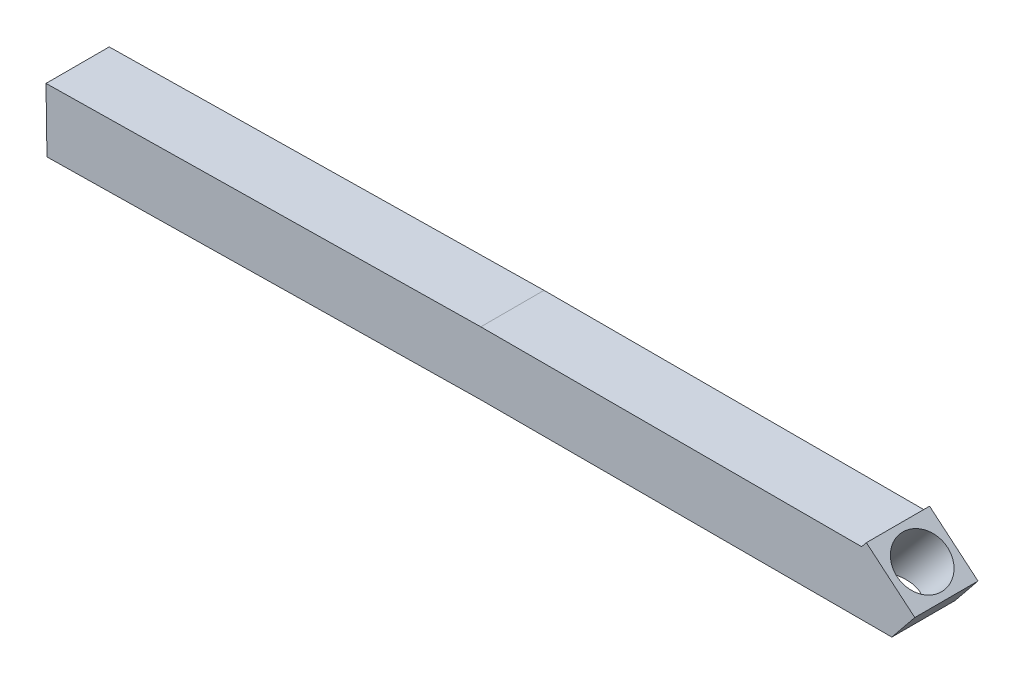
ISO-10303-21;
HEADER;
FILE_DESCRIPTION(('STEP AP214'),'2;1');
FILE_NAME('part.step','',(''),(''),'','','');
FILE_SCHEMA(('AUTOMOTIVE_DESIGN { 1 0 10303 214 1 1 1 1 }'));
ENDSEC;
DATA;
#1=APPLICATION_CONTEXT('core data for automotive mechanical design processes');
#2=APPLICATION_PROTOCOL_DEFINITION('international standard','automotive_design',2000,#1);
#3=PRODUCT_CONTEXT('',#1,'mechanical');
#4=PRODUCT('Part','Part','',(#3));
#5=PRODUCT_RELATED_PRODUCT_CATEGORY('part','',(#4));
#6=PRODUCT_DEFINITION_FORMATION('','',#4);
#7=PRODUCT_DEFINITION_CONTEXT('part definition',#1,'design');
#8=PRODUCT_DEFINITION('design','',#6,#7);
#9=PRODUCT_DEFINITION_SHAPE('','',#8);
#10=(LENGTH_UNIT() NAMED_UNIT(*) SI_UNIT(.MILLI.,.METRE.));
#11=(NAMED_UNIT(*) PLANE_ANGLE_UNIT() SI_UNIT($,.RADIAN.));
#12=(NAMED_UNIT(*) SI_UNIT($,.STERADIAN.) SOLID_ANGLE_UNIT());
#13=UNCERTAINTY_MEASURE_WITH_UNIT(LENGTH_MEASURE(1.E-05),#10,'distance_accuracy_value','');
#14=(GEOMETRIC_REPRESENTATION_CONTEXT(3) GLOBAL_UNCERTAINTY_ASSIGNED_CONTEXT((#13)) GLOBAL_UNIT_ASSIGNED_CONTEXT((#10,
#11,#12)) REPRESENTATION_CONTEXT('',''));
#15=CARTESIAN_POINT('',(0.,0.,0.));
#16=DIRECTION('',(0.,0.,1.));
#17=DIRECTION('',(1.,0.,0.));
#18=AXIS2_PLACEMENT_3D('',#15,#16,#17);
#19=CARTESIAN_POINT('',(0.,0.,2.5));
#20=DIRECTION('',(0.,0.,1.));
#21=DIRECTION('',(1.,0.,0.));
#22=AXIS2_PLACEMENT_3D('',#19,#20,#21);
#23=PLANE('',#22);
#24=DIRECTION('',(0.999885535757896,0.0151299498394764,0.));
#25=VECTOR('',#24,1.);
#26=CARTESIAN_POINT('',(-76.9054286503,-77.8084048068128,2.5));
#27=LINE('',#26,#25);
#28=CARTESIAN_POINT('',(-87.6042038829095,-77.9702952700952,2.5));
#29=VERTEX_POINT('',#28);
#30=CARTESIAN_POINT('',(-70.4061726678737,-77.7100601328562,2.5));
#31=VERTEX_POINT('',#30);
#32=EDGE_CURVE('E133',#29,#31,#27,.T.);
#33=ORIENTED_EDGE('',*,*,#32,.F.);
#34=DIRECTION('',(-0.0151299498394765,0.999885535757896,0.));
#35=VECTOR('',#34,1.);
#36=CARTESIAN_POINT('',(-87.6042038829095,-77.9702952700952,2.5));
#37=LINE('',#36,#35);
#38=CARTESIAN_POINT('',(-87.5663790083108,-80.4700091094899,2.5));
#39=VERTEX_POINT('',#38);
#40=EDGE_CURVE('E50',#39,#29,#37,.T.);
#41=ORIENTED_EDGE('',*,*,#40,.F.);
#42=DIRECTION('',(0.999885535757896,0.0151299498394764,0.));
#43=VECTOR('',#42,1.);
#44=CARTESIAN_POINT('',(-76.8676037757013,-80.3081186462075,2.5));
#45=LINE('',#44,#43);
#46=CARTESIAN_POINT('',(-70.368347793275,-80.2097739722509,2.5));
#47=VERTEX_POINT('',#46);
#48=EDGE_CURVE('E123',#39,#47,#45,.T.);
#49=ORIENTED_EDGE('',*,*,#48,.T.);
#50=DIRECTION('',(1.,0.,0.));
#51=VECTOR('',#50,1.);
#52=CARTESIAN_POINT('',(-70.368347793275,-80.209773972251,2.5));
#53=LINE('',#52,#51);
#54=CARTESIAN_POINT('',(-54.1489938572193,-80.209773972251,2.5));
#55=VERTEX_POINT('',#54);
#56=EDGE_CURVE('E90',#47,#55,#53,.T.);
#57=ORIENTED_EDGE('',*,*,#56,.T.);
#58=DIRECTION('',(0.628267742623942,0.777997200238032,0.));
#59=VECTOR('',#58,1.);
#60=CARTESIAN_POINT('',(-54.1489938572193,-80.209773972251,2.5));
#61=LINE('',#60,#59);
#62=CARTESIAN_POINT('',(-53.2406469454359,-79.0849488280205,2.5));
#63=VERTEX_POINT('',#62);
#64=EDGE_CURVE('E140',#55,#63,#61,.T.);
#65=ORIENTED_EDGE('',*,*,#64,.T.);
#66=DIRECTION('',(-0.766044443118982,0.642787609686535,0.));
#67=VECTOR('',#66,1.);
#68=CARTESIAN_POINT('',(-53.2406469454359,-79.0849488280205,2.5));
#69=LINE('',#68,#67);
#70=CARTESIAN_POINT('',(-55.1557580532333,-77.4779798038041,2.5));
#71=VERTEX_POINT('',#70);
#72=EDGE_CURVE('E143',#63,#71,#69,.T.);
#73=ORIENTED_EDGE('',*,*,#72,.T.);
#74=DIRECTION('',(-0.628267742623952,-0.777997200238024,0.));
#75=VECTOR('',#74,1.);
#76=CARTESIAN_POINT('',(-55.3431733606359,-77.7100601328562,2.5));
#77=LINE('',#76,#75);
#78=CARTESIAN_POINT('',(-55.3431733606359,-77.7100601328562,2.5));
#79=VERTEX_POINT('',#78);
#80=EDGE_CURVE('E59',#71,#79,#77,.T.);
#81=ORIENTED_EDGE('',*,*,#80,.T.);
#82=DIRECTION('',(-1.,0.,0.));
#83=VECTOR('',#82,1.);
#84=CARTESIAN_POINT('',(-70.4061726678737,-77.7100601328562,2.5));
#85=LINE('',#84,#83);
#86=EDGE_CURVE('E146',#79,#31,#85,.T.);
#87=ORIENTED_EDGE('',*,*,#86,.T.);
#88=EDGE_LOOP('',(#33,#41,#49,#57,#65,#73,#81,#87));
#89=FACE_BOUND('',#88,.T.);
#90=ADVANCED_FACE('F35',(#89),#23,.T.);
#91=CARTESIAN_POINT('',(0.,0.,0.));
#92=DIRECTION('',(0.,0.,1.));
#93=DIRECTION('',(1.,0.,0.));
#94=AXIS2_PLACEMENT_3D('',#91,#92,#93);
#95=PLANE('',#94);
#96=DIRECTION('',(0.0151299498394765,-0.999885535757896,0.));
#97=VECTOR('',#96,1.);
#98=CARTESIAN_POINT('',(-87.6042038829095,-77.9702952700952,0.));
#99=LINE('',#98,#97);
#100=CARTESIAN_POINT('',(-87.6042038829095,-77.9702952700952,0.));
#101=VERTEX_POINT('',#100);
#102=CARTESIAN_POINT('',(-87.5663790083108,-80.4700091094899,0.));
#103=VERTEX_POINT('',#102);
#104=EDGE_CURVE('E107',#101,#103,#99,.T.);
#105=ORIENTED_EDGE('',*,*,#104,.F.);
#106=DIRECTION('',(0.999885535757896,0.0151299498394764,0.));
#107=VECTOR('',#106,1.);
#108=CARTESIAN_POINT('',(-76.9054286503,-77.8084048068128,0.));
#109=LINE('',#108,#107);
#110=CARTESIAN_POINT('',(-70.4061726678737,-77.7100601328562,0.));
#111=VERTEX_POINT('',#110);
#112=EDGE_CURVE('E184',#101,#111,#109,.T.);
#113=ORIENTED_EDGE('',*,*,#112,.T.);
#114=DIRECTION('',(-1.,0.,0.));
#115=VECTOR('',#114,1.);
#116=CARTESIAN_POINT('',(-70.4061726678737,-77.7100601328562,0.));
#117=LINE('',#116,#115);
#118=CARTESIAN_POINT('',(-55.3431733606359,-77.7100601328562,0.));
#119=VERTEX_POINT('',#118);
#120=EDGE_CURVE('E141',#119,#111,#117,.T.);
#121=ORIENTED_EDGE('',*,*,#120,.F.);
#122=DIRECTION('',(-0.628267742623952,-0.777997200238024,0.));
#123=VECTOR('',#122,1.);
#124=CARTESIAN_POINT('',(-55.3431733606359,-77.7100601328562,0.));
#125=LINE('',#124,#123);
#126=CARTESIAN_POINT('',(-55.1557580532333,-77.4779798038041,0.));
#127=VERTEX_POINT('',#126);
#128=EDGE_CURVE('E83',#127,#119,#125,.T.);
#129=ORIENTED_EDGE('',*,*,#128,.F.);
#130=DIRECTION('',(-0.766044443118982,0.642787609686535,0.));
#131=VECTOR('',#130,1.);
#132=CARTESIAN_POINT('',(-53.2406469454359,-79.0849488280205,0.));
#133=LINE('',#132,#131);
#134=CARTESIAN_POINT('',(-53.2406469454359,-79.0849488280205,0.));
#135=VERTEX_POINT('',#134);
#136=EDGE_CURVE('E152',#135,#127,#133,.T.);
#137=ORIENTED_EDGE('',*,*,#136,.F.);
#138=DIRECTION('',(0.628267742623942,0.777997200238032,0.));
#139=VECTOR('',#138,1.);
#140=CARTESIAN_POINT('',(-54.1489938572193,-80.209773972251,0.));
#141=LINE('',#140,#139);
#142=CARTESIAN_POINT('',(-54.1489938572193,-80.209773972251,0.));
#143=VERTEX_POINT('',#142);
#144=EDGE_CURVE('E150',#143,#135,#141,.T.);
#145=ORIENTED_EDGE('',*,*,#144,.F.);
#146=DIRECTION('',(1.,0.,0.));
#147=VECTOR('',#146,1.);
#148=CARTESIAN_POINT('',(-70.368347793275,-80.209773972251,0.));
#149=LINE('',#148,#147);
#150=CARTESIAN_POINT('',(-70.368347793275,-80.209773972251,0.));
#151=VERTEX_POINT('',#150);
#152=EDGE_CURVE('E127',#151,#143,#149,.T.);
#153=ORIENTED_EDGE('',*,*,#152,.F.);
#154=DIRECTION('',(0.999885535757896,0.0151299498394764,0.));
#155=VECTOR('',#154,1.);
#156=CARTESIAN_POINT('',(-76.8676037757013,-80.3081186462075,0.));
#157=LINE('',#156,#155);
#158=EDGE_CURVE('E121',#103,#151,#157,.T.);
#159=ORIENTED_EDGE('',*,*,#158,.F.);
#160=EDGE_LOOP('',(#105,#113,#121,#129,#137,#145,#153,#159));
#161=FACE_BOUND('',#160,.T.);
#162=ADVANCED_FACE('F125',(#161),#95,.F.);
#163=CARTESIAN_POINT('',(-76.8676037757013,-80.3081186462075,0.));
#164=DIRECTION('',(-0.0151299498394764,0.999885535757896,0.));
#165=DIRECTION('',(-0.999885535757896,-0.0151299498394764,0.));
#166=AXIS2_PLACEMENT_3D('',#163,#164,#165);
#167=PLANE('',#166);
#168=DIRECTION('',(0.,0.,1.));
#169=VECTOR('',#168,1.);
#170=CARTESIAN_POINT('',(-87.5663790083108,-80.4700091094899,0.));
#171=LINE('',#170,#169);
#172=EDGE_CURVE('E110',#103,#39,#171,.T.);
#173=ORIENTED_EDGE('',*,*,#172,.F.);
#174=ORIENTED_EDGE('',*,*,#158,.T.);
#175=DIRECTION('',(0.,0.,-1.));
#176=VECTOR('',#175,1.);
#177=CARTESIAN_POINT('',(-70.368347793275,-80.209773972251,2.5));
#178=LINE('',#177,#176);
#179=EDGE_CURVE('E11',#47,#151,#178,.T.);
#180=ORIENTED_EDGE('',*,*,#179,.F.);
#181=ORIENTED_EDGE('',*,*,#48,.F.);
#182=EDGE_LOOP('',(#173,#174,#180,#181));
#183=FACE_BOUND('',#182,.T.);
#184=ADVANCED_FACE('F119',(#183),#167,.F.);
#185=CARTESIAN_POINT('',(-76.9054286503,-77.8084048068128,0.));
#186=DIRECTION('',(0.0151299498394764,-0.999885535757896,0.));
#187=DIRECTION('',(0.999885535757896,0.0151299498394764,0.));
#188=AXIS2_PLACEMENT_3D('',#185,#186,#187);
#189=PLANE('',#188);
#190=DIRECTION('',(0.,0.,-1.));
#191=VECTOR('',#190,1.);
#192=CARTESIAN_POINT('',(-87.6042038829095,-77.9702952700952,0.));
#193=LINE('',#192,#191);
#194=EDGE_CURVE('E111',#29,#101,#193,.T.);
#195=ORIENTED_EDGE('',*,*,#194,.F.);
#196=ORIENTED_EDGE('',*,*,#32,.T.);
#197=DIRECTION('',(0.,0.,-1.));
#198=VECTOR('',#197,1.);
#199=CARTESIAN_POINT('',(-70.4061726678737,-77.7100601328562,2.5));
#200=LINE('',#199,#198);
#201=EDGE_CURVE('E148',#31,#111,#200,.T.);
#202=ORIENTED_EDGE('',*,*,#201,.T.);
#203=ORIENTED_EDGE('',*,*,#112,.F.);
#204=EDGE_LOOP('',(#195,#196,#202,#203));
#205=FACE_BOUND('',#204,.T.);
#206=ADVANCED_FACE('F230',(#205),#189,.F.);
#207=CARTESIAN_POINT('',(-70.368347793275,-80.209773972251,2.5));
#208=DIRECTION('',(0.,1.,0.));
#209=DIRECTION('',(0.,0.,1.));
#210=AXIS2_PLACEMENT_3D('',#207,#208,#209);
#211=PLANE('',#210);
#212=CARTESIAN_POINT('',(-55.8162464207639,-80.209773972251,1.25));
#213=DIRECTION('',(0.,1.,0.));
#214=DIRECTION('',(1.,0.,0.));
#215=AXIS2_PLACEMENT_3D('',#212,#213,#214);
#216=ELLIPSE('',#215,1.3054072893277,0.999999999996499);
#217=CARTESIAN_POINT('',(-54.5108391314362,-80.209773972251,1.25));
#218=VERTEX_POINT('',#217);
#219=EDGE_CURVE('E131',#218,#218,#216,.T.);
#220=ORIENTED_EDGE('',*,*,#219,.T.);
#221=EDGE_LOOP('',(#220));
#222=FACE_BOUND('',#221,.T.);
#223=ORIENTED_EDGE('',*,*,#152,.T.);
#224=DIRECTION('',(0.,0.,-1.));
#225=VECTOR('',#224,1.);
#226=CARTESIAN_POINT('',(-54.1489938572193,-80.209773972251,2.5));
#227=LINE('',#226,#225);
#228=EDGE_CURVE('E43',#55,#143,#227,.T.);
#229=ORIENTED_EDGE('',*,*,#228,.F.);
#230=ORIENTED_EDGE('',*,*,#56,.F.);
#231=ORIENTED_EDGE('',*,*,#179,.T.);
#232=EDGE_LOOP('',(#223,#229,#230,#231));
#233=FACE_BOUND('',#232,.T.);
#234=ADVANCED_FACE('F37',(#222,#233),#211,.F.);
#235=CARTESIAN_POINT('',(-54.1489938572193,-80.209773972251,2.5));
#236=DIRECTION('',(-0.777997200238032,0.628267742623942,0.));
#237=DIRECTION('',(-0.628267742623942,-0.777997200238032,0.));
#238=AXIS2_PLACEMENT_3D('',#235,#236,#237);
#239=PLANE('',#238);
#240=ORIENTED_EDGE('',*,*,#144,.T.);
#241=DIRECTION('',(0.,0.,-1.));
#242=VECTOR('',#241,1.);
#243=CARTESIAN_POINT('',(-53.2406469454359,-79.0849488280205,2.5));
#244=LINE('',#243,#242);
#245=EDGE_CURVE('E163',#63,#135,#244,.T.);
#246=ORIENTED_EDGE('',*,*,#245,.F.);
#247=ORIENTED_EDGE('',*,*,#64,.F.);
#248=ORIENTED_EDGE('',*,*,#228,.T.);
#249=EDGE_LOOP('',(#240,#246,#247,#248));
#250=FACE_BOUND('',#249,.T.);
#251=ADVANCED_FACE('F168',(#250),#239,.F.);
#252=CARTESIAN_POINT('',(-53.2406469454359,-79.0849488280205,2.5));
#253=DIRECTION('',(-0.642787609686535,-0.766044443118982,0.));
#254=DIRECTION('',(0.766044443118982,-0.642787609686535,0.));
#255=AXIS2_PLACEMENT_3D('',#252,#253,#254);
#256=PLANE('',#255);
#257=CARTESIAN_POINT('',(-54.1982024993346,-78.2814643159123,1.25));
#258=DIRECTION('',(0.642787609686535,0.766044443118981,0.));
#259=DIRECTION('',(-0.766044443118981,0.642787609686535,0.));
#260=AXIS2_PLACEMENT_3D('',#257,#258,#259);
#261=CIRCLE('',#260,0.999999999996499);
#262=CARTESIAN_POINT('',(-54.9642469424509,-77.6386767062281,1.25));
#263=VERTEX_POINT('',#262);
#264=EDGE_CURVE('E128',#263,#263,#261,.T.);
#265=ORIENTED_EDGE('',*,*,#264,.F.);
#266=EDGE_LOOP('',(#265));
#267=FACE_BOUND('',#266,.T.);
#268=ORIENTED_EDGE('',*,*,#136,.T.);
#269=DIRECTION('',(0.,0.,-1.));
#270=VECTOR('',#269,1.);
#271=CARTESIAN_POINT('',(-55.1557580532333,-77.4779798038041,2.5));
#272=LINE('',#271,#270);
#273=EDGE_CURVE('E161',#71,#127,#272,.T.);
#274=ORIENTED_EDGE('',*,*,#273,.F.);
#275=ORIENTED_EDGE('',*,*,#72,.F.);
#276=ORIENTED_EDGE('',*,*,#245,.T.);
#277=EDGE_LOOP('',(#268,#274,#275,#276));
#278=FACE_BOUND('',#277,.T.);
#279=ADVANCED_FACE('F175',(#267,#278),#256,.F.);
#280=CARTESIAN_POINT('',(-55.3431733606359,-77.7100601328562,2.5));
#281=DIRECTION('',(0.777997200238024,-0.628267742623952,0.));
#282=DIRECTION('',(0.628267742623952,0.777997200238024,0.));
#283=AXIS2_PLACEMENT_3D('',#280,#281,#282);
#284=PLANE('',#283);
#285=ORIENTED_EDGE('',*,*,#128,.T.);
#286=DIRECTION('',(0.,0.,-1.));
#287=VECTOR('',#286,1.);
#288=CARTESIAN_POINT('',(-55.3431733606359,-77.7100601328562,2.5));
#289=LINE('',#288,#287);
#290=EDGE_CURVE('E159',#79,#119,#289,.T.);
#291=ORIENTED_EDGE('',*,*,#290,.F.);
#292=ORIENTED_EDGE('',*,*,#80,.F.);
#293=ORIENTED_EDGE('',*,*,#273,.T.);
#294=EDGE_LOOP('',(#285,#291,#292,#293));
#295=FACE_BOUND('',#294,.T.);
#296=ADVANCED_FACE('F177',(#295),#284,.F.);
#297=CARTESIAN_POINT('',(-70.4061726678737,-77.7100601328562,2.5));
#298=DIRECTION('',(0.,-1.,0.));
#299=DIRECTION('',(0.,0.,-1.));
#300=AXIS2_PLACEMENT_3D('',#297,#298,#299);
#301=PLANE('',#300);
#302=ORIENTED_EDGE('',*,*,#120,.T.);
#303=ORIENTED_EDGE('',*,*,#201,.F.);
#304=ORIENTED_EDGE('',*,*,#86,.F.);
#305=ORIENTED_EDGE('',*,*,#290,.T.);
#306=EDGE_LOOP('',(#302,#303,#304,#305));
#307=FACE_BOUND('',#306,.T.);
#308=ADVANCED_FACE('F181',(#307),#301,.F.);
#309=CARTESIAN_POINT('',(-57.090746742924,-81.7286643099478,1.25));
#310=DIRECTION('',(0.642787609686535,0.766044443118981,0.));
#311=DIRECTION('',(-0.766044443118982,0.642787609686535,0.));
#312=AXIS2_PLACEMENT_3D('',#309,#310,#311);
#313=CYLINDRICAL_SURFACE('',#312,0.999999999996499);
#314=ORIENTED_EDGE('',*,*,#264,.T.);
#315=EDGE_LOOP('',(#314));
#316=FACE_BOUND('',#315,.T.);
#317=ORIENTED_EDGE('',*,*,#219,.F.);
#318=EDGE_LOOP('',(#317));
#319=FACE_BOUND('',#318,.T.);
#320=ADVANCED_FACE('F204',(#316,#319),#313,.F.);
#321=CARTESIAN_POINT('',(-88.7637015575668,-1.34314409410301,0.));
#322=DIRECTION('',(-0.999885535757896,-0.0151299498394765,0.));
#323=DIRECTION('',(0.0151299498394765,-0.999885535757896,0.));
#324=AXIS2_PLACEMENT_3D('',#321,#322,#323);
#325=PLANE('',#324);
#326=CARTESIAN_POINT('',(-87.5852914456102,-79.2201521897926,1.25));
#327=DIRECTION('',(-0.999885535757896,-0.0151299498394765,0.));
#328=DIRECTION('',(0.0151299498394765,-0.999885535757896,0.));
#329=AXIS2_PLACEMENT_3D('',#326,#327,#328);
#330=CIRCLE('',#329,1.);
#331=CARTESIAN_POINT('',(-87.5701614957707,-80.2200377255505,1.25));
#332=VERTEX_POINT('',#331);
#333=EDGE_CURVE('E189',#332,#332,#330,.T.);
#334=ORIENTED_EDGE('',*,*,#333,.F.);
#335=EDGE_LOOP('',(#334));
#336=FACE_BOUND('',#335,.T.);
#337=ORIENTED_EDGE('',*,*,#104,.T.);
#338=ORIENTED_EDGE('',*,*,#172,.T.);
#339=ORIENTED_EDGE('',*,*,#40,.T.);
#340=ORIENTED_EDGE('',*,*,#194,.T.);
#341=EDGE_LOOP('',(#337,#338,#339,#340));
#342=FACE_BOUND('',#341,.T.);
#343=ADVANCED_FACE('F109',(#336,#342),#325,.T.);
#344=CARTESIAN_POINT('',(-82.5858637668207,-79.1445024405952,1.25));
#345=DIRECTION('',(-0.999885535757896,-0.0151299498394765,0.));
#346=DIRECTION('',(0.0151299498394765,-0.999885535757896,0.));
#347=AXIS2_PLACEMENT_3D('',#344,#345,#346);
#348=CYLINDRICAL_SURFACE('',#347,1.);
#349=CARTESIAN_POINT('',(-82.5858637668207,-79.1445024405952,1.25));
#350=DIRECTION('',(-0.999885535757896,-0.0151299498394765,0.));
#351=DIRECTION('',(0.0151299498394765,-0.999885535757896,0.));
#352=AXIS2_PLACEMENT_3D('',#349,#350,#351);
#353=CIRCLE('',#352,1.);
#354=CARTESIAN_POINT('',(-82.5707338169812,-80.1443879763531,1.25));
#355=VERTEX_POINT('',#354);
#356=EDGE_CURVE('E115',#355,#355,#353,.T.);
#357=ORIENTED_EDGE('',*,*,#356,.F.);
#358=EDGE_LOOP('',(#357));
#359=FACE_BOUND('',#358,.T.);
#360=ORIENTED_EDGE('',*,*,#333,.T.);
#361=EDGE_LOOP('',(#360));
#362=FACE_BOUND('',#361,.T.);
#363=ADVANCED_FACE('F197',(#359,#362),#348,.F.);
#364=CARTESIAN_POINT('',(-82.5858637668207,-79.1445024405952,1.25));
#365=DIRECTION('',(-0.999885535757896,-0.0151299498394765,0.));
#366=DIRECTION('',(0.0151299498394765,-0.999885535757896,0.));
#367=AXIS2_PLACEMENT_3D('',#364,#365,#366);
#368=PLANE('',#367);
#369=ORIENTED_EDGE('',*,*,#356,.T.);
#370=EDGE_LOOP('',(#369));
#371=FACE_BOUND('',#370,.T.);
#372=ADVANCED_FACE('F195',(#371),#368,.T.);
#373=CLOSED_SHELL('',(#90,#162,#184,#206,#234,#251,#279,#296,#308,#320,#343,#363,#372));
#374=MANIFOLD_SOLID_BREP('B2',#373);
#375=ADVANCED_BREP_SHAPE_REPRESENTATION('',(#18,#374),#14);
#376=SHAPE_DEFINITION_REPRESENTATION(#9,#375);
ENDSEC;
END-ISO-10303-21;
